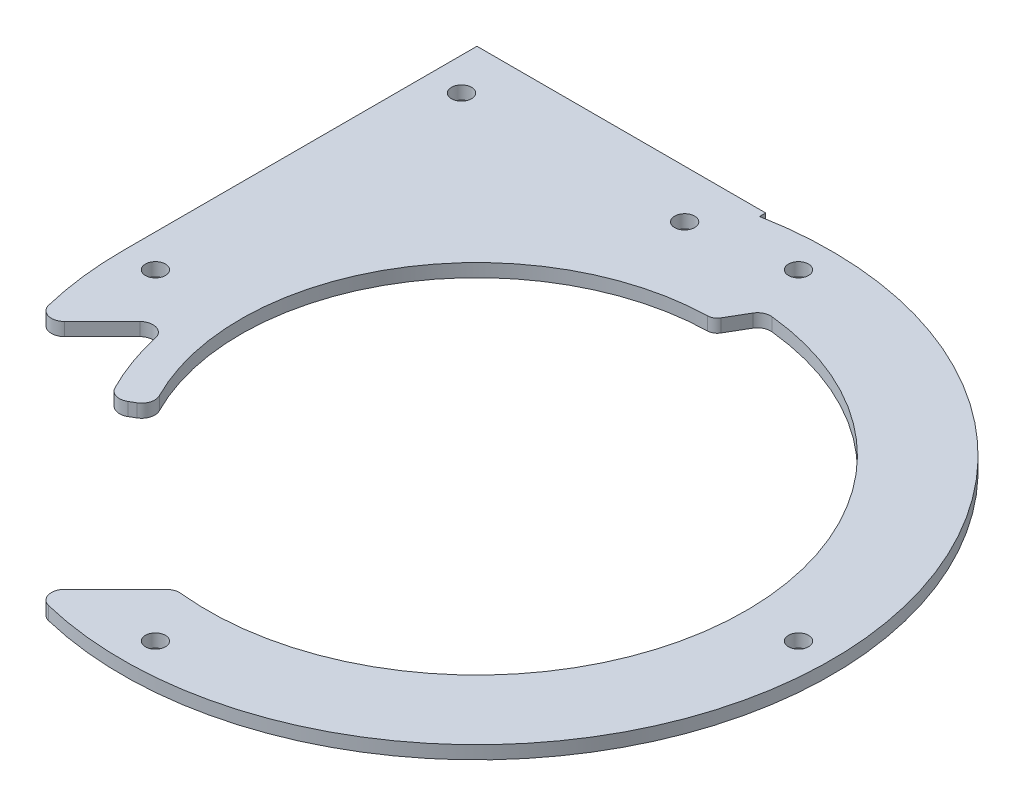
ISO-10303-21;
HEADER;
FILE_DESCRIPTION(('STEP AP214'),'2;1');
FILE_NAME('part.step','',(''),(''),'','','');
FILE_SCHEMA(('AUTOMOTIVE_DESIGN { 1 0 10303 214 1 1 1 1 }'));
ENDSEC;
DATA;
#1=APPLICATION_CONTEXT('core data for automotive mechanical design processes');
#2=APPLICATION_PROTOCOL_DEFINITION('international standard','automotive_design',2000,#1);
#3=PRODUCT_CONTEXT('',#1,'mechanical');
#4=PRODUCT('Part','Part','',(#3));
#5=PRODUCT_RELATED_PRODUCT_CATEGORY('part','',(#4));
#6=PRODUCT_DEFINITION_FORMATION('','',#4);
#7=PRODUCT_DEFINITION_CONTEXT('part definition',#1,'design');
#8=PRODUCT_DEFINITION('design','',#6,#7);
#9=PRODUCT_DEFINITION_SHAPE('','',#8);
#10=(LENGTH_UNIT() NAMED_UNIT(*) SI_UNIT(.MILLI.,.METRE.));
#11=(NAMED_UNIT(*) PLANE_ANGLE_UNIT() SI_UNIT($,.RADIAN.));
#12=(NAMED_UNIT(*) SI_UNIT($,.STERADIAN.) SOLID_ANGLE_UNIT());
#13=UNCERTAINTY_MEASURE_WITH_UNIT(LENGTH_MEASURE(1.E-05),#10,'distance_accuracy_value','');
#14=(GEOMETRIC_REPRESENTATION_CONTEXT(3) GLOBAL_UNCERTAINTY_ASSIGNED_CONTEXT((#13)) GLOBAL_UNIT_ASSIGNED_CONTEXT((#10,
#11,#12)) REPRESENTATION_CONTEXT('',''));
#15=CARTESIAN_POINT('',(0.,0.,0.));
#16=DIRECTION('',(0.,0.,1.));
#17=DIRECTION('',(1.,0.,0.));
#18=AXIS2_PLACEMENT_3D('',#15,#16,#17);
#19=CARTESIAN_POINT('',(0.,0.,0.));
#20=DIRECTION('',(0.,1.,0.));
#21=DIRECTION('',(0.,0.,1.));
#22=AXIS2_PLACEMENT_3D('',#19,#20,#21);
#23=PLANE('',#22);
#24=CARTESIAN_POINT('',(-49.,0.,-46.6476151587624));
#25=DIRECTION('',(0.,1.,0.));
#26=DIRECTION('',(0.,0.,1.));
#27=AXIS2_PLACEMENT_3D('',#24,#25,#26);
#28=CIRCLE('',#27,1.525);
#29=CARTESIAN_POINT('',(-49.,0.,-45.1226151587624));
#30=VERTEX_POINT('',#29);
#31=EDGE_CURVE('E199',#30,#30,#28,.T.);
#32=ORIENTED_EDGE('',*,*,#31,.T.);
#33=EDGE_LOOP('',(#32));
#34=FACE_BOUND('',#33,.T.);
#35=CARTESIAN_POINT('',(-49.,0.,0.));
#36=DIRECTION('',(0.,1.,0.));
#37=DIRECTION('',(0.,0.,1.));
#38=AXIS2_PLACEMENT_3D('',#35,#36,#37);
#39=CIRCLE('',#38,1.525);
#40=CARTESIAN_POINT('',(-49.,0.,1.525));
#41=VERTEX_POINT('',#40);
#42=EDGE_CURVE('E231',#41,#41,#39,.T.);
#43=ORIENTED_EDGE('',*,*,#42,.T.);
#44=EDGE_LOOP('',(#43));
#45=FACE_BOUND('',#44,.T.);
#46=CARTESIAN_POINT('',(0.,0.,49.));
#47=DIRECTION('',(0.,1.,0.));
#48=DIRECTION('',(0.,0.,1.));
#49=AXIS2_PLACEMENT_3D('',#46,#47,#48);
#50=CIRCLE('',#49,1.525);
#51=CARTESIAN_POINT('',(0.,0.,50.525));
#52=VERTEX_POINT('',#51);
#53=EDGE_CURVE('E241',#52,#52,#50,.T.);
#54=ORIENTED_EDGE('',*,*,#53,.T.);
#55=EDGE_LOOP('',(#54));
#56=FACE_BOUND('',#55,.T.);
#57=CARTESIAN_POINT('',(49.,0.,0.));
#58=DIRECTION('',(0.,1.,0.));
#59=DIRECTION('',(0.,0.,1.));
#60=AXIS2_PLACEMENT_3D('',#57,#58,#59);
#61=CIRCLE('',#60,1.525);
#62=CARTESIAN_POINT('',(49.,0.,1.52499999999999));
#63=VERTEX_POINT('',#62);
#64=EDGE_CURVE('E248',#63,#63,#61,.T.);
#65=ORIENTED_EDGE('',*,*,#64,.T.);
#66=EDGE_LOOP('',(#65));
#67=FACE_BOUND('',#66,.T.);
#68=CARTESIAN_POINT('',(0.,0.,-49.));
#69=DIRECTION('',(0.,1.,0.));
#70=DIRECTION('',(0.,0.,1.));
#71=AXIS2_PLACEMENT_3D('',#68,#69,#70);
#72=CIRCLE('',#71,1.525);
#73=CARTESIAN_POINT('',(0.,0.,-47.475));
#74=VERTEX_POINT('',#73);
#75=EDGE_CURVE('E259',#74,#74,#72,.T.);
#76=ORIENTED_EDGE('',*,*,#75,.T.);
#77=EDGE_LOOP('',(#76));
#78=FACE_BOUND('',#77,.T.);
#79=CARTESIAN_POINT('',(-15.,0.,-46.6476151587624));
#80=DIRECTION('',(0.,1.,0.));
#81=DIRECTION('',(0.,0.,1.));
#82=AXIS2_PLACEMENT_3D('',#79,#80,#81);
#83=CIRCLE('',#82,1.525);
#84=CARTESIAN_POINT('',(-15.,0.,-45.1226151587624));
#85=VERTEX_POINT('',#84);
#86=EDGE_CURVE('E263',#85,#85,#83,.T.);
#87=ORIENTED_EDGE('',*,*,#86,.T.);
#88=EDGE_LOOP('',(#87));
#89=FACE_BOUND('',#88,.T.);
#90=DIRECTION('',(-0.707106781186546,0.,0.707106781186549));
#91=VECTOR('',#90,1.);
#92=CARTESIAN_POINT('',(-16.1675664718771,0.,51.5229055312046));
#93=LINE('',#92,#91);
#94=CARTESIAN_POINT('',(-5.98664960273474,0.,41.3419886620622));
#95=VERTEX_POINT('',#94);
#96=CARTESIAN_POINT('',(-13.7468431952776,0.,49.102182254605));
#97=VERTEX_POINT('',#96);
#98=EDGE_CURVE('E445',#95,#97,#93,.T.);
#99=ORIENTED_EDGE('',*,*,#98,.F.);
#100=CARTESIAN_POINT('',(-4.57243604036164,0.,42.7562022244353));
#101=DIRECTION('',(0.,1.,0.));
#102=DIRECTION('',(0.,0.,1.));
#103=AXIS2_PLACEMENT_3D('',#100,#101,#102);
#104=CIRCLE('',#103,2.);
#105=CARTESIAN_POINT('',(-4.35976459662389,0.,40.7675416558569));
#106=VERTEX_POINT('',#105);
#107=EDGE_CURVE('E364',#95,#106,#104,.F.);
#108=ORIENTED_EDGE('',*,*,#107,.T.);
#109=CARTESIAN_POINT('',(0.,0.,0.));
#110=DIRECTION('',(0.,1.,0.));
#111=DIRECTION('',(0.,0.,1.));
#112=AXIS2_PLACEMENT_3D('',#109,#110,#111);
#113=CIRCLE('',#112,41.);
#114=CARTESIAN_POINT('',(4.1522376609048,0.,-40.7892010513489));
#115=VERTEX_POINT('',#114);
#116=EDGE_CURVE('E271',#106,#115,#113,.T.);
#117=ORIENTED_EDGE('',*,*,#116,.T.);
#118=CARTESIAN_POINT('',(3.94968948232408,0.,-38.7994839268929));
#119=DIRECTION('',(0.,1.,0.));
#120=DIRECTION('',(0.,0.,1.));
#121=AXIS2_PLACEMENT_3D('',#118,#119,#120);
#122=CIRCLE('',#121,2.);
#123=CARTESIAN_POINT('',(2.22237851866699,0.,-39.8076490100167));
#124=VERTEX_POINT('',#123);
#125=EDGE_CURVE('E332',#115,#124,#122,.T.);
#126=ORIENTED_EDGE('',*,*,#125,.T.);
#127=DIRECTION('',(0.504082541561901,0.,-0.863655481828544));
#128=VECTOR('',#127,1.);
#129=CARTESIAN_POINT('',(0.428319210888115,0.,-36.7338485346267));
#130=LINE('',#129,#128);
#131=CARTESIAN_POINT('',(0.428319210888115,0.,-36.7338485346267));
#132=VERTEX_POINT('',#131);
#133=EDGE_CURVE('E209',#132,#124,#130,.T.);
#134=ORIENTED_EDGE('',*,*,#133,.F.);
#135=CARTESIAN_POINT('',(-0.867164011854708,0.,-37.4899723469696));
#136=DIRECTION('',(0.,1.,0.));
#137=DIRECTION('',(0.,0.,1.));
#138=AXIS2_PLACEMENT_3D('',#135,#136,#137);
#139=CIRCLE('',#138,1.5);
#140=CARTESIAN_POINT('',(-0.832477451380507,0.,-35.9903734530908));
#141=VERTEX_POINT('',#140);
#142=EDGE_CURVE('E210',#141,#132,#139,.T.);
#143=ORIENTED_EDGE('',*,*,#142,.F.);
#144=CARTESIAN_POINT('',(0.,0.,0.));
#145=DIRECTION('',(0.,-1.,0.));
#146=DIRECTION('',(0.,0.,1.));
#147=AXIS2_PLACEMENT_3D('',#144,#145,#146);
#148=CIRCLE('',#147,36.);
#149=CARTESIAN_POINT('',(-32.0810716897673,0.,16.3341617243129));
#150=VERTEX_POINT('',#149);
#151=EDGE_CURVE('E222',#150,#141,#148,.T.);
#152=ORIENTED_EDGE('',*,*,#151,.F.);
#153=CARTESIAN_POINT('',(-33.86335345031,0.,17.2416151534414));
#154=DIRECTION('',(0.,1.,0.));
#155=DIRECTION('',(0.,0.,1.));
#156=AXIS2_PLACEMENT_3D('',#153,#154,#155);
#157=CIRCLE('',#156,2.);
#158=CARTESIAN_POINT('',(-32.86335345031,0.,18.9736659610103));
#159=VERTEX_POINT('',#158);
#160=EDGE_CURVE('E355',#150,#159,#157,.F.);
#161=ORIENTED_EDGE('',*,*,#160,.T.);
#162=DIRECTION('',(-0.866025403784438,0.,0.5));
#163=VECTOR('',#162,1.);
#164=CARTESIAN_POINT('',(-31.1769145362398,0.,18.));
#165=LINE('',#164,#163);
#166=CARTESIAN_POINT('',(-33.7305499510459,0.,19.4743420941505));
#167=VERTEX_POINT('',#166);
#168=EDGE_CURVE('E441',#159,#167,#165,.T.);
#169=ORIENTED_EDGE('',*,*,#168,.T.);
#170=CARTESIAN_POINT('',(-34.7305499510459,0.,17.7422912865816));
#171=DIRECTION('',(0.,1.,0.));
#172=DIRECTION('',(0.,0.,1.));
#173=AXIS2_PLACEMENT_3D('',#170,#171,#172);
#174=CIRCLE('',#173,2.);
#175=CARTESIAN_POINT('',(-36.5116037946892,0.,18.6521523782012));
#176=VERTEX_POINT('',#175);
#177=EDGE_CURVE('E363',#167,#176,#174,.F.);
#178=ORIENTED_EDGE('',*,*,#177,.T.);
#179=CARTESIAN_POINT('',(0.,0.,0.));
#180=DIRECTION('',(0.,1.,0.));
#181=DIRECTION('',(0.,0.,1.));
#182=AXIS2_PLACEMENT_3D('',#179,#180,#181);
#183=CIRCLE('',#182,41.);
#184=CARTESIAN_POINT('',(-40.0025759560338,0.,8.98854364631698));
#185=VERTEX_POINT('',#184);
#186=EDGE_CURVE('E421',#185,#176,#183,.T.);
#187=ORIENTED_EDGE('',*,*,#186,.F.);
#188=CARTESIAN_POINT('',(-41.9539211246208,0.,9.42700919003975));
#189=DIRECTION('',(0.,1.,0.));
#190=DIRECTION('',(0.,0.,1.));
#191=AXIS2_PLACEMENT_3D('',#188,#189,#190);
#192=CIRCLE('',#191,2.);
#193=CARTESIAN_POINT('',(-43.3681346869939,0.,8.01279562766666));
#194=VERTEX_POINT('',#193);
#195=EDGE_CURVE('E59',#185,#194,#192,.T.);
#196=ORIENTED_EDGE('',*,*,#195,.T.);
#197=DIRECTION('',(0.707106781186547,0.,-0.707106781186548));
#198=VECTOR('',#197,1.);
#199=CARTESIAN_POINT('',(-51.5229055312045,0.,16.1675664718773));
#200=LINE('',#199,#198);
#201=CARTESIAN_POINT('',(-49.102182254605,0.,13.7468431952777));
#202=VERTEX_POINT('',#201);
#203=EDGE_CURVE('E423',#202,#194,#200,.T.);
#204=ORIENTED_EDGE('',*,*,#203,.F.);
#205=CARTESIAN_POINT('',(-50.5163958169781,0.,12.3326296329046));
#206=DIRECTION('',(0.,1.,0.));
#207=DIRECTION('',(0.,0.,1.));
#208=AXIS2_PLACEMENT_3D('',#205,#206,#207);
#209=CIRCLE('',#208,2.);
#210=CARTESIAN_POINT('',(-52.4593341176311,0.,12.8069615418625));
#211=VERTEX_POINT('',#210);
#212=EDGE_CURVE('E356',#202,#211,#209,.F.);
#213=ORIENTED_EDGE('',*,*,#212,.T.);
#214=CARTESIAN_POINT('',(0.,0.,0.));
#215=DIRECTION('',(0.,1.,0.));
#216=DIRECTION('',(0.,0.,1.));
#217=AXIS2_PLACEMENT_3D('',#214,#215,#216);
#218=CIRCLE('',#217,54.);
#219=CARTESIAN_POINT('',(-54.,0.,0.));
#220=VERTEX_POINT('',#219);
#221=EDGE_CURVE('E296',#220,#211,#218,.T.);
#222=ORIENTED_EDGE('',*,*,#221,.F.);
#223=DIRECTION('',(0.,0.,1.));
#224=VECTOR('',#223,1.);
#225=CARTESIAN_POINT('',(-54.,0.,0.));
#226=LINE('',#225,#224);
#227=CARTESIAN_POINT('',(-54.,0.,-54.));
#228=VERTEX_POINT('',#227);
#229=EDGE_CURVE('E310',#228,#220,#226,.T.);
#230=ORIENTED_EDGE('',*,*,#229,.F.);
#231=DIRECTION('',(-1.,0.,0.));
#232=VECTOR('',#231,1.);
#233=CARTESIAN_POINT('',(-54.,0.,-54.));
#234=LINE('',#233,#232);
#235=CARTESIAN_POINT('',(-10.,0.,-54.));
#236=VERTEX_POINT('',#235);
#237=EDGE_CURVE('E304',#236,#228,#234,.T.);
#238=ORIENTED_EDGE('',*,*,#237,.F.);
#239=DIRECTION('',(0.,0.,-1.));
#240=VECTOR('',#239,1.);
#241=CARTESIAN_POINT('',(-10.,0.,-54.));
#242=LINE('',#241,#240);
#243=CARTESIAN_POINT('',(-10.,0.,-53.0659966456864));
#244=VERTEX_POINT('',#243);
#245=EDGE_CURVE('E305',#244,#236,#242,.T.);
#246=ORIENTED_EDGE('',*,*,#245,.F.);
#247=CARTESIAN_POINT('',(-12.8069615418623,0.,52.4593341176311));
#248=VERTEX_POINT('',#247);
#249=EDGE_CURVE('E278',#248,#244,#218,.T.);
#250=ORIENTED_EDGE('',*,*,#249,.F.);
#251=CARTESIAN_POINT('',(-12.3326296329045,0.,50.5163958169781));
#252=DIRECTION('',(0.,1.,0.));
#253=DIRECTION('',(0.,0.,1.));
#254=AXIS2_PLACEMENT_3D('',#251,#252,#253);
#255=CIRCLE('',#254,2.);
#256=EDGE_CURVE('E353',#248,#97,#255,.F.);
#257=ORIENTED_EDGE('',*,*,#256,.T.);
#258=EDGE_LOOP('',(#99,#108,#117,#126,#134,#143,#152,#161,#169,#178,#187,#196,#204,#213,#222,
#230,#238,#246,#250,#257));
#259=FACE_BOUND('',#258,.T.);
#260=ADVANCED_FACE('F47',(#34,#45,#56,#67,#78,#89,#259),#23,.F.);
#261=CARTESIAN_POINT('',(0.,2.,0.));
#262=DIRECTION('',(0.,-1.,0.));
#263=DIRECTION('',(0.,0.,-1.));
#264=AXIS2_PLACEMENT_3D('',#261,#262,#263);
#265=CYLINDRICAL_SURFACE('',#264,54.);
#266=ORIENTED_EDGE('',*,*,#221,.T.);
#267=DIRECTION('',(0.,-1.,0.));
#268=VECTOR('',#267,1.);
#269=CARTESIAN_POINT('',(-52.4593341176311,2.,12.8069615418625));
#270=LINE('',#269,#268);
#271=CARTESIAN_POINT('',(-52.4593341176311,2.,12.8069615418625));
#272=VERTEX_POINT('',#271);
#273=EDGE_CURVE('E404',#211,#272,#270,.F.);
#274=ORIENTED_EDGE('',*,*,#273,.T.);
#275=CARTESIAN_POINT('',(0.,2.,0.));
#276=DIRECTION('',(0.,1.,0.));
#277=DIRECTION('',(0.,0.,1.));
#278=AXIS2_PLACEMENT_3D('',#275,#276,#277);
#279=CIRCLE('',#278,54.);
#280=CARTESIAN_POINT('',(-54.,2.,0.));
#281=VERTEX_POINT('',#280);
#282=EDGE_CURVE('E284',#281,#272,#279,.T.);
#283=ORIENTED_EDGE('',*,*,#282,.F.);
#284=DIRECTION('',(0.,-1.,0.));
#285=VECTOR('',#284,1.);
#286=CARTESIAN_POINT('',(-54.,2.,0.));
#287=LINE('',#286,#285);
#288=EDGE_CURVE('E300',#281,#220,#287,.T.);
#289=ORIENTED_EDGE('',*,*,#288,.T.);
#290=EDGE_LOOP('',(#266,#274,#283,#289));
#291=FACE_BOUND('',#290,.T.);
#292=ADVANCED_FACE('F560',(#291),#265,.T.);
#293=CARTESIAN_POINT('',(0.,2.,0.));
#294=DIRECTION('',(0.,-1.,0.));
#295=DIRECTION('',(0.,0.,-1.));
#296=AXIS2_PLACEMENT_3D('',#293,#294,#295);
#297=CYLINDRICAL_SURFACE('',#296,41.);
#298=ORIENTED_EDGE('',*,*,#116,.F.);
#299=DIRECTION('',(0.,-1.,0.));
#300=VECTOR('',#299,1.);
#301=CARTESIAN_POINT('',(-4.35976459662389,2.,40.7675416558569));
#302=LINE('',#301,#300);
#303=CARTESIAN_POINT('',(-4.35976459662389,2.,40.7675416558569));
#304=VERTEX_POINT('',#303);
#305=EDGE_CURVE('E370',#106,#304,#302,.F.);
#306=ORIENTED_EDGE('',*,*,#305,.T.);
#307=CARTESIAN_POINT('',(0.,2.,0.));
#308=DIRECTION('',(0.,1.,0.));
#309=DIRECTION('',(0.,0.,1.));
#310=AXIS2_PLACEMENT_3D('',#307,#308,#309);
#311=CIRCLE('',#310,41.);
#312=CARTESIAN_POINT('',(4.1522376609048,2.,-40.7892010513489));
#313=VERTEX_POINT('',#312);
#314=EDGE_CURVE('E279',#304,#313,#311,.T.);
#315=ORIENTED_EDGE('',*,*,#314,.T.);
#316=DIRECTION('',(0.,-1.,0.));
#317=VECTOR('',#316,1.);
#318=CARTESIAN_POINT('',(4.1522376609048,2.,-40.7892010513489));
#319=LINE('',#318,#317);
#320=EDGE_CURVE('E323',#313,#115,#319,.T.);
#321=ORIENTED_EDGE('',*,*,#320,.T.);
#322=EDGE_LOOP('',(#298,#306,#315,#321));
#323=FACE_BOUND('',#322,.T.);
#324=ADVANCED_FACE('F574',(#323),#297,.F.);
#325=CARTESIAN_POINT('',(0.,2.,0.));
#326=DIRECTION('',(0.,1.,0.));
#327=DIRECTION('',(0.,0.,1.));
#328=AXIS2_PLACEMENT_3D('',#325,#326,#327);
#329=PLANE('',#328);
#330=ORIENTED_EDGE('',*,*,#314,.F.);
#331=CARTESIAN_POINT('',(-4.57243604036164,2.,42.7562022244353));
#332=DIRECTION('',(0.,1.,0.));
#333=DIRECTION('',(0.,0.,1.));
#334=AXIS2_PLACEMENT_3D('',#331,#332,#333);
#335=CIRCLE('',#334,2.);
#336=CARTESIAN_POINT('',(-5.98664960273474,2.,41.3419886620622));
#337=VERTEX_POINT('',#336);
#338=EDGE_CURVE('E379',#304,#337,#335,.T.);
#339=ORIENTED_EDGE('',*,*,#338,.T.);
#340=DIRECTION('',(0.707106781186546,0.,-0.707106781186549));
#341=VECTOR('',#340,1.);
#342=CARTESIAN_POINT('',(17.6776695296637,2.,17.6776695296636));
#343=LINE('',#342,#341);
#344=CARTESIAN_POINT('',(-13.7468431952776,2.,49.102182254605));
#345=VERTEX_POINT('',#344);
#346=EDGE_CURVE('E342',#345,#337,#343,.T.);
#347=ORIENTED_EDGE('',*,*,#346,.F.);
#348=CARTESIAN_POINT('',(-12.3326296329045,2.,50.5163958169781));
#349=DIRECTION('',(0.,1.,0.));
#350=DIRECTION('',(0.,0.,1.));
#351=AXIS2_PLACEMENT_3D('',#348,#349,#350);
#352=CIRCLE('',#351,2.);
#353=CARTESIAN_POINT('',(-12.8069615418623,2.,52.4593341176311));
#354=VERTEX_POINT('',#353);
#355=EDGE_CURVE('E375',#345,#354,#352,.T.);
#356=ORIENTED_EDGE('',*,*,#355,.T.);
#357=CARTESIAN_POINT('',(-10.,2.,-53.0659966456864));
#358=VERTEX_POINT('',#357);
#359=EDGE_CURVE('E289',#354,#358,#279,.T.);
#360=ORIENTED_EDGE('',*,*,#359,.T.);
#361=DIRECTION('',(0.,0.,-1.));
#362=VECTOR('',#361,1.);
#363=CARTESIAN_POINT('',(-10.,2.,-54.));
#364=LINE('',#363,#362);
#365=CARTESIAN_POINT('',(-10.,2.,-54.));
#366=VERTEX_POINT('',#365);
#367=EDGE_CURVE('E290',#358,#366,#364,.T.);
#368=ORIENTED_EDGE('',*,*,#367,.T.);
#369=DIRECTION('',(-1.,0.,0.));
#370=VECTOR('',#369,1.);
#371=CARTESIAN_POINT('',(-54.,2.,-54.));
#372=LINE('',#371,#370);
#373=CARTESIAN_POINT('',(-54.,2.,-54.));
#374=VERTEX_POINT('',#373);
#375=EDGE_CURVE('E293',#366,#374,#372,.T.);
#376=ORIENTED_EDGE('',*,*,#375,.T.);
#377=DIRECTION('',(0.,0.,1.));
#378=VECTOR('',#377,1.);
#379=CARTESIAN_POINT('',(-54.,2.,0.));
#380=LINE('',#379,#378);
#381=EDGE_CURVE('E295',#374,#281,#380,.T.);
#382=ORIENTED_EDGE('',*,*,#381,.T.);
#383=ORIENTED_EDGE('',*,*,#282,.T.);
#384=CARTESIAN_POINT('',(-50.5163958169781,2.,12.3326296329046));
#385=DIRECTION('',(0.,1.,0.));
#386=DIRECTION('',(0.,0.,1.));
#387=AXIS2_PLACEMENT_3D('',#384,#385,#386);
#388=CIRCLE('',#387,2.);
#389=CARTESIAN_POINT('',(-49.102182254605,2.,13.7468431952777));
#390=VERTEX_POINT('',#389);
#391=EDGE_CURVE('E374',#272,#390,#388,.T.);
#392=ORIENTED_EDGE('',*,*,#391,.T.);
#393=DIRECTION('',(-0.707106781186547,0.,0.707106781186548));
#394=VECTOR('',#393,1.);
#395=CARTESIAN_POINT('',(-17.6776695296637,2.,-17.6776695296636));
#396=LINE('',#395,#394);
#397=CARTESIAN_POINT('',(-43.3681346869939,2.,8.01279562766666));
#398=VERTEX_POINT('',#397);
#399=EDGE_CURVE('E340',#398,#390,#396,.T.);
#400=ORIENTED_EDGE('',*,*,#399,.F.);
#401=CARTESIAN_POINT('',(-41.9539211246208,2.,9.42700919003975));
#402=DIRECTION('',(0.,1.,0.));
#403=DIRECTION('',(0.,0.,1.));
#404=AXIS2_PLACEMENT_3D('',#401,#402,#403);
#405=CIRCLE('',#404,2.);
#406=CARTESIAN_POINT('',(-40.0025759560338,2.,8.98854364631698));
#407=VERTEX_POINT('',#406);
#408=EDGE_CURVE('E11',#398,#407,#405,.F.);
#409=ORIENTED_EDGE('',*,*,#408,.T.);
#410=CARTESIAN_POINT('',(0.,2.,0.));
#411=DIRECTION('',(0.,1.,0.));
#412=DIRECTION('',(0.,0.,1.));
#413=AXIS2_PLACEMENT_3D('',#410,#411,#412);
#414=CIRCLE('',#413,41.);
#415=CARTESIAN_POINT('',(-36.5116037946892,2.,18.6521523782012));
#416=VERTEX_POINT('',#415);
#417=EDGE_CURVE('E436',#416,#407,#414,.F.);
#418=ORIENTED_EDGE('',*,*,#417,.F.);
#419=CARTESIAN_POINT('',(-34.7305499510459,2.,17.7422912865816));
#420=DIRECTION('',(0.,1.,0.));
#421=DIRECTION('',(0.,0.,1.));
#422=AXIS2_PLACEMENT_3D('',#419,#420,#421);
#423=CIRCLE('',#422,2.);
#424=CARTESIAN_POINT('',(-33.7305499510459,2.,19.4743420941505));
#425=VERTEX_POINT('',#424);
#426=EDGE_CURVE('E72',#416,#425,#423,.T.);
#427=ORIENTED_EDGE('',*,*,#426,.T.);
#428=DIRECTION('',(-0.866025403784438,0.,0.5));
#429=VECTOR('',#428,1.);
#430=CARTESIAN_POINT('',(-31.1769145362398,2.,18.));
#431=LINE('',#430,#429);
#432=CARTESIAN_POINT('',(-32.86335345031,2.,18.9736659610103));
#433=VERTEX_POINT('',#432);
#434=EDGE_CURVE('E226',#433,#425,#431,.T.);
#435=ORIENTED_EDGE('',*,*,#434,.F.);
#436=CARTESIAN_POINT('',(-33.86335345031,2.,17.2416151534414));
#437=DIRECTION('',(0.,1.,0.));
#438=DIRECTION('',(0.,0.,1.));
#439=AXIS2_PLACEMENT_3D('',#436,#437,#438);
#440=CIRCLE('',#439,2.);
#441=CARTESIAN_POINT('',(-32.0810716897673,2.,16.3341617243129));
#442=VERTEX_POINT('',#441);
#443=EDGE_CURVE('E63',#433,#442,#440,.T.);
#444=ORIENTED_EDGE('',*,*,#443,.T.);
#445=CARTESIAN_POINT('',(0.,2.,0.));
#446=DIRECTION('',(0.,1.,0.));
#447=DIRECTION('',(0.,0.,1.));
#448=AXIS2_PLACEMENT_3D('',#445,#446,#447);
#449=CIRCLE('',#448,36.);
#450=CARTESIAN_POINT('',(-0.832477451380507,2.,-35.9903734530908));
#451=VERTEX_POINT('',#450);
#452=EDGE_CURVE('E211',#442,#451,#449,.F.);
#453=ORIENTED_EDGE('',*,*,#452,.T.);
#454=CARTESIAN_POINT('',(-0.867164011854708,2.,-37.4899723469696));
#455=DIRECTION('',(0.,1.,0.));
#456=DIRECTION('',(0.,0.,1.));
#457=AXIS2_PLACEMENT_3D('',#454,#455,#456);
#458=CIRCLE('',#457,1.5);
#459=CARTESIAN_POINT('',(0.428319210888115,2.,-36.7338485346267));
#460=VERTEX_POINT('',#459);
#461=EDGE_CURVE('E196',#451,#460,#458,.T.);
#462=ORIENTED_EDGE('',*,*,#461,.T.);
#463=DIRECTION('',(0.504082541561901,0.,-0.863655481828544));
#464=VECTOR('',#463,1.);
#465=CARTESIAN_POINT('',(0.428319210888115,2.,-36.7338485346267));
#466=LINE('',#465,#464);
#467=CARTESIAN_POINT('',(2.22237851866699,2.,-39.8076490100167));
#468=VERTEX_POINT('',#467);
#469=EDGE_CURVE('E187',#460,#468,#466,.T.);
#470=ORIENTED_EDGE('',*,*,#469,.T.);
#471=CARTESIAN_POINT('',(3.94968948232408,2.,-38.7994839268929));
#472=DIRECTION('',(0.,1.,0.));
#473=DIRECTION('',(0.,0.,1.));
#474=AXIS2_PLACEMENT_3D('',#471,#472,#473);
#475=CIRCLE('',#474,2.);
#476=EDGE_CURVE('E331',#468,#313,#475,.F.);
#477=ORIENTED_EDGE('',*,*,#476,.T.);
#478=EDGE_LOOP('',(#330,#339,#347,#356,#360,#368,#376,#382,#383,#392,#400,#409,#418,#427,#435,
#444,#453,#462,#470,#477));
#479=FACE_BOUND('',#478,.T.);
#480=CARTESIAN_POINT('',(-49.,2.,0.));
#481=DIRECTION('',(0.,1.,0.));
#482=DIRECTION('',(0.,0.,1.));
#483=AXIS2_PLACEMENT_3D('',#480,#481,#482);
#484=CIRCLE('',#483,1.525);
#485=CARTESIAN_POINT('',(-49.,2.,1.525));
#486=VERTEX_POINT('',#485);
#487=EDGE_CURVE('E240',#486,#486,#484,.T.);
#488=ORIENTED_EDGE('',*,*,#487,.F.);
#489=EDGE_LOOP('',(#488));
#490=FACE_BOUND('',#489,.T.);
#491=CARTESIAN_POINT('',(49.,2.,0.));
#492=DIRECTION('',(0.,1.,0.));
#493=DIRECTION('',(0.,0.,1.));
#494=AXIS2_PLACEMENT_3D('',#491,#492,#493);
#495=CIRCLE('',#494,1.525);
#496=CARTESIAN_POINT('',(49.,2.,1.52499999999999));
#497=VERTEX_POINT('',#496);
#498=EDGE_CURVE('E254',#497,#497,#495,.T.);
#499=ORIENTED_EDGE('',*,*,#498,.F.);
#500=EDGE_LOOP('',(#499));
#501=FACE_BOUND('',#500,.T.);
#502=CARTESIAN_POINT('',(-15.,2.,-46.6476151587624));
#503=DIRECTION('',(0.,1.,0.));
#504=DIRECTION('',(0.,0.,1.));
#505=AXIS2_PLACEMENT_3D('',#502,#503,#504);
#506=CIRCLE('',#505,1.525);
#507=CARTESIAN_POINT('',(-15.,2.,-45.1226151587624));
#508=VERTEX_POINT('',#507);
#509=EDGE_CURVE('E266',#508,#508,#506,.T.);
#510=ORIENTED_EDGE('',*,*,#509,.F.);
#511=EDGE_LOOP('',(#510));
#512=FACE_BOUND('',#511,.T.);
#513=CARTESIAN_POINT('',(0.,2.,-49.));
#514=DIRECTION('',(0.,1.,0.));
#515=DIRECTION('',(0.,0.,1.));
#516=AXIS2_PLACEMENT_3D('',#513,#514,#515);
#517=CIRCLE('',#516,1.525);
#518=CARTESIAN_POINT('',(0.,2.,-47.475));
#519=VERTEX_POINT('',#518);
#520=EDGE_CURVE('E262',#519,#519,#517,.T.);
#521=ORIENTED_EDGE('',*,*,#520,.F.);
#522=EDGE_LOOP('',(#521));
#523=FACE_BOUND('',#522,.T.);
#524=CARTESIAN_POINT('',(0.,2.,49.));
#525=DIRECTION('',(0.,1.,0.));
#526=DIRECTION('',(0.,0.,1.));
#527=AXIS2_PLACEMENT_3D('',#524,#525,#526);
#528=CIRCLE('',#527,1.525);
#529=CARTESIAN_POINT('',(0.,2.,50.525));
#530=VERTEX_POINT('',#529);
#531=EDGE_CURVE('E244',#530,#530,#528,.T.);
#532=ORIENTED_EDGE('',*,*,#531,.F.);
#533=EDGE_LOOP('',(#532));
#534=FACE_BOUND('',#533,.T.);
#535=CARTESIAN_POINT('',(-49.,2.,-46.6476151587624));
#536=DIRECTION('',(0.,1.,0.));
#537=DIRECTION('',(0.,0.,1.));
#538=AXIS2_PLACEMENT_3D('',#535,#536,#537);
#539=CIRCLE('',#538,1.525);
#540=CARTESIAN_POINT('',(-49.,2.,-45.1226151587624));
#541=VERTEX_POINT('',#540);
#542=EDGE_CURVE('E230',#541,#541,#539,.T.);
#543=ORIENTED_EDGE('',*,*,#542,.F.);
#544=EDGE_LOOP('',(#543));
#545=FACE_BOUND('',#544,.T.);
#546=ADVANCED_FACE('F214',(#479,#490,#501,#512,#523,#534,#545),#329,.T.);
#547=ORIENTED_EDGE('',*,*,#359,.F.);
#548=DIRECTION('',(0.,-1.,0.));
#549=VECTOR('',#548,1.);
#550=CARTESIAN_POINT('',(-12.8069615418623,2.,52.4593341176311));
#551=LINE('',#550,#549);
#552=EDGE_CURVE('E409',#354,#248,#551,.T.);
#553=ORIENTED_EDGE('',*,*,#552,.T.);
#554=ORIENTED_EDGE('',*,*,#249,.T.);
#555=DIRECTION('',(0.,-1.,0.));
#556=VECTOR('',#555,1.);
#557=CARTESIAN_POINT('',(-10.,2.,-53.0659966456864));
#558=LINE('',#557,#556);
#559=EDGE_CURVE('E322',#358,#244,#558,.T.);
#560=ORIENTED_EDGE('',*,*,#559,.F.);
#561=EDGE_LOOP('',(#547,#553,#554,#560));
#562=FACE_BOUND('',#561,.T.);
#563=ADVANCED_FACE('F542',(#562),#265,.T.);
#564=CARTESIAN_POINT('',(-10.,2.,-54.));
#565=DIRECTION('',(-1.,0.,0.));
#566=DIRECTION('',(0.,0.,1.));
#567=AXIS2_PLACEMENT_3D('',#564,#565,#566);
#568=PLANE('',#567);
#569=ORIENTED_EDGE('',*,*,#245,.T.);
#570=DIRECTION('',(0.,-1.,0.));
#571=VECTOR('',#570,1.);
#572=CARTESIAN_POINT('',(-10.,2.,-54.));
#573=LINE('',#572,#571);
#574=EDGE_CURVE('E320',#366,#236,#573,.T.);
#575=ORIENTED_EDGE('',*,*,#574,.F.);
#576=ORIENTED_EDGE('',*,*,#367,.F.);
#577=ORIENTED_EDGE('',*,*,#559,.T.);
#578=EDGE_LOOP('',(#569,#575,#576,#577));
#579=FACE_BOUND('',#578,.T.);
#580=ADVANCED_FACE('F536',(#579),#568,.F.);
#581=CARTESIAN_POINT('',(-54.,2.,-54.));
#582=DIRECTION('',(0.,0.,1.));
#583=DIRECTION('',(1.,0.,0.));
#584=AXIS2_PLACEMENT_3D('',#581,#582,#583);
#585=PLANE('',#584);
#586=ORIENTED_EDGE('',*,*,#237,.T.);
#587=DIRECTION('',(0.,-1.,0.));
#588=VECTOR('',#587,1.);
#589=CARTESIAN_POINT('',(-54.,2.,-54.));
#590=LINE('',#589,#588);
#591=EDGE_CURVE('E312',#374,#228,#590,.T.);
#592=ORIENTED_EDGE('',*,*,#591,.F.);
#593=ORIENTED_EDGE('',*,*,#375,.F.);
#594=ORIENTED_EDGE('',*,*,#574,.T.);
#595=EDGE_LOOP('',(#586,#592,#593,#594));
#596=FACE_BOUND('',#595,.T.);
#597=ADVANCED_FACE('F550',(#596),#585,.F.);
#598=CARTESIAN_POINT('',(-54.,2.,0.));
#599=DIRECTION('',(1.,0.,0.));
#600=DIRECTION('',(0.,0.,-1.));
#601=AXIS2_PLACEMENT_3D('',#598,#599,#600);
#602=PLANE('',#601);
#603=ORIENTED_EDGE('',*,*,#229,.T.);
#604=ORIENTED_EDGE('',*,*,#288,.F.);
#605=ORIENTED_EDGE('',*,*,#381,.F.);
#606=ORIENTED_EDGE('',*,*,#591,.T.);
#607=EDGE_LOOP('',(#603,#604,#605,#606));
#608=FACE_BOUND('',#607,.T.);
#609=ADVANCED_FACE('F555',(#608),#602,.F.);
#610=CARTESIAN_POINT('',(-15.,2.,-46.6476151587624));
#611=DIRECTION('',(0.,-1.,0.));
#612=DIRECTION('',(0.,0.,-1.));
#613=AXIS2_PLACEMENT_3D('',#610,#611,#612);
#614=CYLINDRICAL_SURFACE('',#613,1.525);
#615=ORIENTED_EDGE('',*,*,#509,.T.);
#616=EDGE_LOOP('',(#615));
#617=FACE_BOUND('',#616,.T.);
#618=ORIENTED_EDGE('',*,*,#86,.F.);
#619=EDGE_LOOP('',(#618));
#620=FACE_BOUND('',#619,.T.);
#621=ADVANCED_FACE('F585',(#617,#620),#614,.F.);
#622=CARTESIAN_POINT('',(0.,2.,-49.));
#623=DIRECTION('',(0.,-1.,0.));
#624=DIRECTION('',(0.,0.,-1.));
#625=AXIS2_PLACEMENT_3D('',#622,#623,#624);
#626=CYLINDRICAL_SURFACE('',#625,1.525);
#627=ORIENTED_EDGE('',*,*,#520,.T.);
#628=EDGE_LOOP('',(#627));
#629=FACE_BOUND('',#628,.T.);
#630=ORIENTED_EDGE('',*,*,#75,.F.);
#631=EDGE_LOOP('',(#630));
#632=FACE_BOUND('',#631,.T.);
#633=ADVANCED_FACE('F626',(#629,#632),#626,.F.);
#634=CARTESIAN_POINT('',(49.,2.,0.));
#635=DIRECTION('',(0.,-1.,0.));
#636=DIRECTION('',(0.,0.,-1.));
#637=AXIS2_PLACEMENT_3D('',#634,#635,#636);
#638=CYLINDRICAL_SURFACE('',#637,1.525);
#639=ORIENTED_EDGE('',*,*,#498,.T.);
#640=EDGE_LOOP('',(#639));
#641=FACE_BOUND('',#640,.T.);
#642=ORIENTED_EDGE('',*,*,#64,.F.);
#643=EDGE_LOOP('',(#642));
#644=FACE_BOUND('',#643,.T.);
#645=ADVANCED_FACE('F629',(#641,#644),#638,.F.);
#646=CARTESIAN_POINT('',(0.,2.,49.));
#647=DIRECTION('',(0.,-1.,0.));
#648=DIRECTION('',(0.,0.,-1.));
#649=AXIS2_PLACEMENT_3D('',#646,#647,#648);
#650=CYLINDRICAL_SURFACE('',#649,1.525);
#651=ORIENTED_EDGE('',*,*,#531,.T.);
#652=EDGE_LOOP('',(#651));
#653=FACE_BOUND('',#652,.T.);
#654=ORIENTED_EDGE('',*,*,#53,.F.);
#655=EDGE_LOOP('',(#654));
#656=FACE_BOUND('',#655,.T.);
#657=ADVANCED_FACE('F632',(#653,#656),#650,.F.);
#658=CARTESIAN_POINT('',(-49.,2.,0.));
#659=DIRECTION('',(0.,-1.,0.));
#660=DIRECTION('',(0.,0.,-1.));
#661=AXIS2_PLACEMENT_3D('',#658,#659,#660);
#662=CYLINDRICAL_SURFACE('',#661,1.525);
#663=ORIENTED_EDGE('',*,*,#487,.T.);
#664=EDGE_LOOP('',(#663));
#665=FACE_BOUND('',#664,.T.);
#666=ORIENTED_EDGE('',*,*,#42,.F.);
#667=EDGE_LOOP('',(#666));
#668=FACE_BOUND('',#667,.T.);
#669=ADVANCED_FACE('F637',(#665,#668),#662,.F.);
#670=CARTESIAN_POINT('',(-49.,2.,-46.6476151587624));
#671=DIRECTION('',(0.,-1.,0.));
#672=DIRECTION('',(0.,0.,-1.));
#673=AXIS2_PLACEMENT_3D('',#670,#671,#672);
#674=CYLINDRICAL_SURFACE('',#673,1.525);
#675=ORIENTED_EDGE('',*,*,#542,.T.);
#676=EDGE_LOOP('',(#675));
#677=FACE_BOUND('',#676,.T.);
#678=ORIENTED_EDGE('',*,*,#31,.F.);
#679=EDGE_LOOP('',(#678));
#680=FACE_BOUND('',#679,.T.);
#681=ADVANCED_FACE('F645',(#677,#680),#674,.F.);
#682=CARTESIAN_POINT('',(-0.867164011854708,62.0391618275141,-37.4899723469696));
#683=DIRECTION('',(0.,-1.,0.));
#684=DIRECTION('',(0.,0.,-1.));
#685=AXIS2_PLACEMENT_3D('',#682,#683,#684);
#686=CYLINDRICAL_SURFACE('',#685,1.5);
#687=ORIENTED_EDGE('',*,*,#461,.F.);
#688=DIRECTION('',(0.,-1.,0.));
#689=VECTOR('',#688,1.);
#690=CARTESIAN_POINT('',(-0.832477451380507,62.0391618275141,-35.9903734530908));
#691=LINE('',#690,#689);
#692=EDGE_CURVE('E223',#451,#141,#691,.T.);
#693=ORIENTED_EDGE('',*,*,#692,.T.);
#694=ORIENTED_EDGE('',*,*,#142,.T.);
#695=DIRECTION('',(0.,-1.,0.));
#696=VECTOR('',#695,1.);
#697=CARTESIAN_POINT('',(0.428319210888115,62.0391618275141,-36.7338485346267));
#698=LINE('',#697,#696);
#699=EDGE_CURVE('E188',#460,#132,#698,.T.);
#700=ORIENTED_EDGE('',*,*,#699,.F.);
#701=EDGE_LOOP('',(#687,#693,#694,#700));
#702=FACE_BOUND('',#701,.T.);
#703=ADVANCED_FACE('F201',(#702),#686,.T.);
#704=CARTESIAN_POINT('',(0.428319210888115,62.0391618275141,-36.7338485346267));
#705=DIRECTION('',(-0.863655481828544,0.,-0.504082541561901));
#706=DIRECTION('',(-0.504082541561901,0.,0.863655481828544));
#707=AXIS2_PLACEMENT_3D('',#704,#705,#706);
#708=PLANE('',#707);
#709=ORIENTED_EDGE('',*,*,#133,.T.);
#710=DIRECTION('',(0.,-1.,0.));
#711=VECTOR('',#710,1.);
#712=CARTESIAN_POINT('',(2.22237851866699,62.0391618275141,-39.8076490100167));
#713=LINE('',#712,#711);
#714=EDGE_CURVE('E195',#124,#468,#713,.F.);
#715=ORIENTED_EDGE('',*,*,#714,.T.);
#716=ORIENTED_EDGE('',*,*,#469,.F.);
#717=ORIENTED_EDGE('',*,*,#699,.T.);
#718=EDGE_LOOP('',(#709,#715,#716,#717));
#719=FACE_BOUND('',#718,.T.);
#720=ADVANCED_FACE('F186',(#719),#708,.F.);
#721=CARTESIAN_POINT('',(0.,62.0391618275141,0.));
#722=DIRECTION('',(0.,-1.,0.));
#723=DIRECTION('',(0.,0.,-1.));
#724=AXIS2_PLACEMENT_3D('',#721,#722,#723);
#725=CYLINDRICAL_SURFACE('',#724,36.);
#726=ORIENTED_EDGE('',*,*,#452,.F.);
#727=DIRECTION('',(0.,-1.,0.));
#728=VECTOR('',#727,1.);
#729=CARTESIAN_POINT('',(-32.0810716897673,62.0391618275141,16.3341617243129));
#730=LINE('',#729,#728);
#731=EDGE_CURVE('E412',#442,#150,#730,.T.);
#732=ORIENTED_EDGE('',*,*,#731,.T.);
#733=ORIENTED_EDGE('',*,*,#151,.T.);
#734=ORIENTED_EDGE('',*,*,#692,.F.);
#735=EDGE_LOOP('',(#726,#732,#733,#734));
#736=FACE_BOUND('',#735,.T.);
#737=ADVANCED_FACE('F594',(#736),#725,.F.);
#738=CARTESIAN_POINT('',(3.94968948232408,2.,-38.7994839268929));
#739=DIRECTION('',(0.,-1.,0.));
#740=DIRECTION('',(0.,0.,-1.));
#741=AXIS2_PLACEMENT_3D('',#738,#739,#740);
#742=CYLINDRICAL_SURFACE('',#741,2.);
#743=ORIENTED_EDGE('',*,*,#476,.F.);
#744=ORIENTED_EDGE('',*,*,#714,.F.);
#745=ORIENTED_EDGE('',*,*,#125,.F.);
#746=ORIENTED_EDGE('',*,*,#320,.F.);
#747=EDGE_LOOP('',(#743,#744,#745,#746));
#748=FACE_BOUND('',#747,.T.);
#749=ADVANCED_FACE('F586',(#748),#742,.F.);
#750=CARTESIAN_POINT('',(-31.1769145362398,2.,18.));
#751=DIRECTION('',(0.500000000000001,0.,0.866025403784438));
#752=DIRECTION('',(0.866025403784438,0.,-0.500000000000001));
#753=AXIS2_PLACEMENT_3D('',#750,#751,#752);
#754=PLANE('',#753);
#755=ORIENTED_EDGE('',*,*,#434,.T.);
#756=DIRECTION('',(0.,1.,0.));
#757=VECTOR('',#756,1.);
#758=CARTESIAN_POINT('',(-33.7305499510459,0.,19.4743420941505));
#759=LINE('',#758,#757);
#760=EDGE_CURVE('E387',#425,#167,#759,.F.);
#761=ORIENTED_EDGE('',*,*,#760,.T.);
#762=ORIENTED_EDGE('',*,*,#168,.F.);
#763=DIRECTION('',(0.,1.,0.));
#764=VECTOR('',#763,1.);
#765=CARTESIAN_POINT('',(-32.86335345031,2.,18.9736659610103));
#766=LINE('',#765,#764);
#767=EDGE_CURVE('E384',#159,#433,#766,.T.);
#768=ORIENTED_EDGE('',*,*,#767,.T.);
#769=EDGE_LOOP('',(#755,#761,#762,#768));
#770=FACE_BOUND('',#769,.T.);
#771=ADVANCED_FACE('F595',(#770),#754,.T.);
#772=CARTESIAN_POINT('',(-51.5229055312045,10.,16.1675664718773));
#773=DIRECTION('',(-0.707106781186548,0.,-0.707106781186547));
#774=DIRECTION('',(-0.707106781186547,0.,0.707106781186548));
#775=AXIS2_PLACEMENT_3D('',#772,#773,#774);
#776=PLANE('',#775);
#777=ORIENTED_EDGE('',*,*,#203,.T.);
#778=DIRECTION('',(0.,1.,0.));
#779=VECTOR('',#778,1.);
#780=CARTESIAN_POINT('',(-43.3681346869939,2.,8.01279562766666));
#781=LINE('',#780,#779);
#782=EDGE_CURVE('E402',#194,#398,#781,.T.);
#783=ORIENTED_EDGE('',*,*,#782,.T.);
#784=ORIENTED_EDGE('',*,*,#399,.T.);
#785=DIRECTION('',(0.,-1.,0.));
#786=VECTOR('',#785,1.);
#787=CARTESIAN_POINT('',(-49.102182254605,10.,13.7468431952777));
#788=LINE('',#787,#786);
#789=EDGE_CURVE('E400',#390,#202,#788,.T.);
#790=ORIENTED_EDGE('',*,*,#789,.T.);
#791=EDGE_LOOP('',(#777,#783,#784,#790));
#792=FACE_BOUND('',#791,.T.);
#793=ADVANCED_FACE('F426',(#792),#776,.F.);
#794=CARTESIAN_POINT('',(0.,10.,0.));
#795=DIRECTION('',(0.,-1.,0.));
#796=DIRECTION('',(0.,0.,-1.));
#797=AXIS2_PLACEMENT_3D('',#794,#795,#796);
#798=CYLINDRICAL_SURFACE('',#797,41.);
#799=ORIENTED_EDGE('',*,*,#186,.T.);
#800=DIRECTION('',(0.,-1.,0.));
#801=VECTOR('',#800,1.);
#802=CARTESIAN_POINT('',(-36.5116037946892,10.,18.6521523782012));
#803=LINE('',#802,#801);
#804=EDGE_CURVE('E391',#176,#416,#803,.F.);
#805=ORIENTED_EDGE('',*,*,#804,.T.);
#806=ORIENTED_EDGE('',*,*,#417,.T.);
#807=DIRECTION('',(0.,-1.,0.));
#808=VECTOR('',#807,1.);
#809=CARTESIAN_POINT('',(-40.0025759560338,10.,8.98854364631698));
#810=LINE('',#809,#808);
#811=EDGE_CURVE('E388',#407,#185,#810,.T.);
#812=ORIENTED_EDGE('',*,*,#811,.T.);
#813=EDGE_LOOP('',(#799,#805,#806,#812));
#814=FACE_BOUND('',#813,.T.);
#815=ADVANCED_FACE('F438',(#814),#798,.T.);
#816=CARTESIAN_POINT('',(-16.1675664718771,10.,51.5229055312046));
#817=DIRECTION('',(0.707106781186549,0.,0.707106781186546));
#818=DIRECTION('',(0.707106781186546,0.,-0.707106781186549));
#819=AXIS2_PLACEMENT_3D('',#816,#817,#818);
#820=PLANE('',#819);
#821=ORIENTED_EDGE('',*,*,#346,.T.);
#822=DIRECTION('',(0.,1.,0.));
#823=VECTOR('',#822,1.);
#824=CARTESIAN_POINT('',(-5.98664960273474,0.,41.3419886620622));
#825=LINE('',#824,#823);
#826=EDGE_CURVE('E349',#337,#95,#825,.F.);
#827=ORIENTED_EDGE('',*,*,#826,.T.);
#828=ORIENTED_EDGE('',*,*,#98,.T.);
#829=DIRECTION('',(0.,-1.,0.));
#830=VECTOR('',#829,1.);
#831=CARTESIAN_POINT('',(-13.7468431952776,10.,49.102182254605));
#832=LINE('',#831,#830);
#833=EDGE_CURVE('E343',#97,#345,#832,.F.);
#834=ORIENTED_EDGE('',*,*,#833,.T.);
#835=EDGE_LOOP('',(#821,#827,#828,#834));
#836=FACE_BOUND('',#835,.T.);
#837=ADVANCED_FACE('F596',(#836),#820,.F.);
#838=CARTESIAN_POINT('',(-4.57243604036164,2.,42.7562022244353));
#839=DIRECTION('',(0.,-1.,0.));
#840=DIRECTION('',(0.,0.,-1.));
#841=AXIS2_PLACEMENT_3D('',#838,#839,#840);
#842=CYLINDRICAL_SURFACE('',#841,2.);
#843=ORIENTED_EDGE('',*,*,#338,.F.);
#844=ORIENTED_EDGE('',*,*,#305,.F.);
#845=ORIENTED_EDGE('',*,*,#107,.F.);
#846=ORIENTED_EDGE('',*,*,#826,.F.);
#847=EDGE_LOOP('',(#843,#844,#845,#846));
#848=FACE_BOUND('',#847,.T.);
#849=ADVANCED_FACE('F593',(#848),#842,.T.);
#850=CARTESIAN_POINT('',(-34.7305499510459,10.,17.7422912865816));
#851=DIRECTION('',(0.,-1.,0.));
#852=DIRECTION('',(0.,0.,-1.));
#853=AXIS2_PLACEMENT_3D('',#850,#851,#852);
#854=CYLINDRICAL_SURFACE('',#853,2.);
#855=ORIENTED_EDGE('',*,*,#426,.F.);
#856=ORIENTED_EDGE('',*,*,#804,.F.);
#857=ORIENTED_EDGE('',*,*,#177,.F.);
#858=ORIENTED_EDGE('',*,*,#760,.F.);
#859=EDGE_LOOP('',(#855,#856,#857,#858));
#860=FACE_BOUND('',#859,.T.);
#861=ADVANCED_FACE('F568',(#860),#854,.T.);
#862=CARTESIAN_POINT('',(-41.9539211246208,10.,9.42700919003975));
#863=DIRECTION('',(0.,-1.,0.));
#864=DIRECTION('',(0.,0.,-1.));
#865=AXIS2_PLACEMENT_3D('',#862,#863,#864);
#866=CYLINDRICAL_SURFACE('',#865,2.);
#867=ORIENTED_EDGE('',*,*,#408,.F.);
#868=ORIENTED_EDGE('',*,*,#782,.F.);
#869=ORIENTED_EDGE('',*,*,#195,.F.);
#870=ORIENTED_EDGE('',*,*,#811,.F.);
#871=EDGE_LOOP('',(#867,#868,#869,#870));
#872=FACE_BOUND('',#871,.T.);
#873=ADVANCED_FACE('F432',(#872),#866,.F.);
#874=CARTESIAN_POINT('',(-50.5163958169781,2.,12.3326296329046));
#875=DIRECTION('',(0.,-1.,0.));
#876=DIRECTION('',(0.,0.,-1.));
#877=AXIS2_PLACEMENT_3D('',#874,#875,#876);
#878=CYLINDRICAL_SURFACE('',#877,2.);
#879=ORIENTED_EDGE('',*,*,#391,.F.);
#880=ORIENTED_EDGE('',*,*,#273,.F.);
#881=ORIENTED_EDGE('',*,*,#212,.F.);
#882=ORIENTED_EDGE('',*,*,#789,.F.);
#883=EDGE_LOOP('',(#879,#880,#881,#882));
#884=FACE_BOUND('',#883,.T.);
#885=ADVANCED_FACE('F557',(#884),#878,.T.);
#886=CARTESIAN_POINT('',(-12.3326296329045,2.,50.5163958169781));
#887=DIRECTION('',(0.,-1.,0.));
#888=DIRECTION('',(0.,0.,-1.));
#889=AXIS2_PLACEMENT_3D('',#886,#887,#888);
#890=CYLINDRICAL_SURFACE('',#889,2.);
#891=ORIENTED_EDGE('',*,*,#355,.F.);
#892=ORIENTED_EDGE('',*,*,#833,.F.);
#893=ORIENTED_EDGE('',*,*,#256,.F.);
#894=ORIENTED_EDGE('',*,*,#552,.F.);
#895=EDGE_LOOP('',(#891,#892,#893,#894));
#896=FACE_BOUND('',#895,.T.);
#897=ADVANCED_FACE('F565',(#896),#890,.T.);
#898=CARTESIAN_POINT('',(-33.86335345031,62.0391618275141,17.2416151534414));
#899=DIRECTION('',(0.,-1.,0.));
#900=DIRECTION('',(0.,0.,-1.));
#901=AXIS2_PLACEMENT_3D('',#898,#899,#900);
#902=CYLINDRICAL_SURFACE('',#901,2.);
#903=ORIENTED_EDGE('',*,*,#443,.F.);
#904=ORIENTED_EDGE('',*,*,#767,.F.);
#905=ORIENTED_EDGE('',*,*,#160,.F.);
#906=ORIENTED_EDGE('',*,*,#731,.F.);
#907=EDGE_LOOP('',(#903,#904,#905,#906));
#908=FACE_BOUND('',#907,.T.);
#909=ADVANCED_FACE('F51',(#908),#902,.T.);
#910=CLOSED_SHELL('',(#260,#292,#324,#546,#563,#580,#597,#609,#621,#633,#645,#657,#669,#681,
#703,#720,#737,#749,#771,#793,#815,#837,#849,#861,#873,#885,#897,#909));
#911=MANIFOLD_SOLID_BREP('B2',#910);
#912=ADVANCED_BREP_SHAPE_REPRESENTATION('',(#18,#911),#14);
#913=SHAPE_DEFINITION_REPRESENTATION(#9,#912);
ENDSEC;
END-ISO-10303-21;
